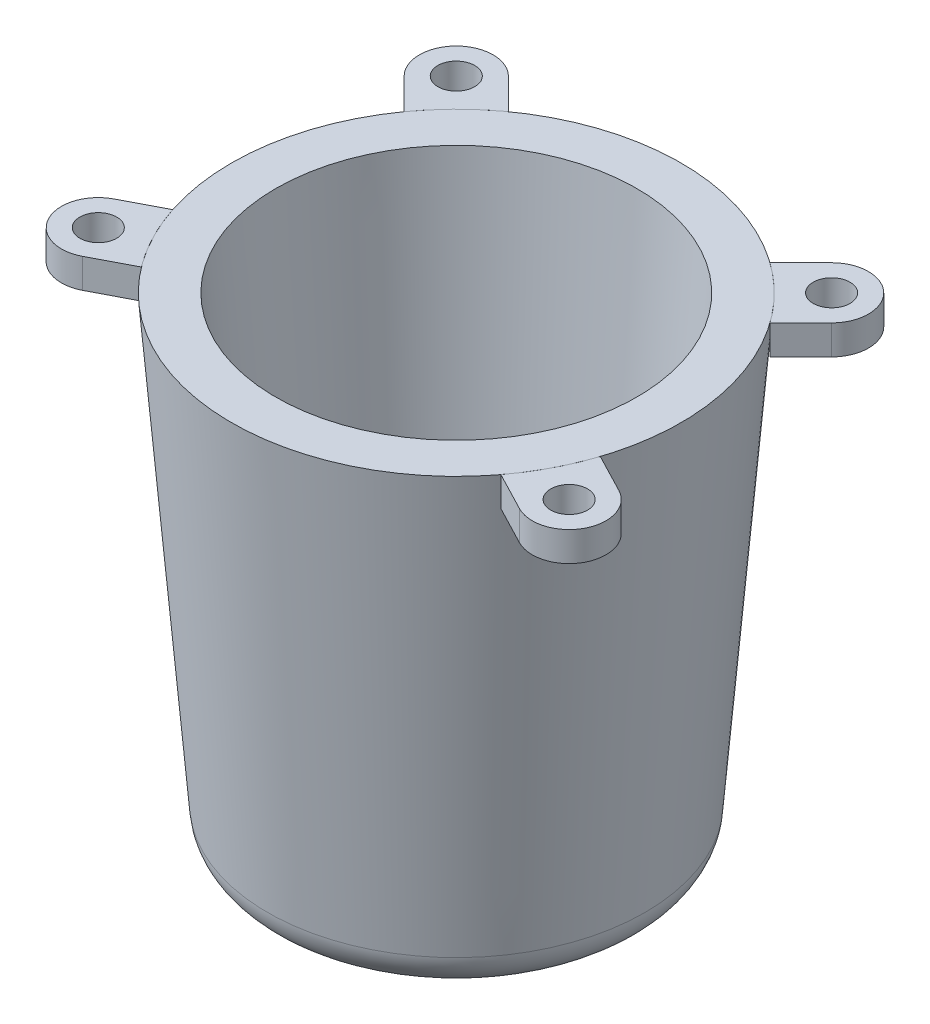
ISO-10303-21;
HEADER;
FILE_DESCRIPTION(('STEP AP214'),'2;1');
FILE_NAME('part.step','',(''),(''),'','','');
FILE_SCHEMA(('AUTOMOTIVE_DESIGN { 1 0 10303 214 1 1 1 1 }'));
ENDSEC;
DATA;
#1=APPLICATION_CONTEXT('core data for automotive mechanical design processes');
#2=APPLICATION_PROTOCOL_DEFINITION('international standard','automotive_design',2000,#1);
#3=PRODUCT_CONTEXT('',#1,'mechanical');
#4=PRODUCT('Part','Part','',(#3));
#5=PRODUCT_RELATED_PRODUCT_CATEGORY('part','',(#4));
#6=PRODUCT_DEFINITION_FORMATION('','',#4);
#7=PRODUCT_DEFINITION_CONTEXT('part definition',#1,'design');
#8=PRODUCT_DEFINITION('design','',#6,#7);
#9=PRODUCT_DEFINITION_SHAPE('','',#8);
#10=(LENGTH_UNIT() NAMED_UNIT(*) SI_UNIT(.MILLI.,.METRE.));
#11=(NAMED_UNIT(*) PLANE_ANGLE_UNIT() SI_UNIT($,.RADIAN.));
#12=(NAMED_UNIT(*) SI_UNIT($,.STERADIAN.) SOLID_ANGLE_UNIT());
#13=UNCERTAINTY_MEASURE_WITH_UNIT(LENGTH_MEASURE(1.E-05),#10,'distance_accuracy_value','');
#14=(GEOMETRIC_REPRESENTATION_CONTEXT(3) GLOBAL_UNCERTAINTY_ASSIGNED_CONTEXT((#13)) GLOBAL_UNIT_ASSIGNED_CONTEXT((#10,
#11,#12)) REPRESENTATION_CONTEXT('',''));
#15=CARTESIAN_POINT('',(0.,0.,0.));
#16=DIRECTION('',(0.,0.,1.));
#17=DIRECTION('',(1.,0.,0.));
#18=AXIS2_PLACEMENT_3D('',#15,#16,#17);
#19=CARTESIAN_POINT('',(15.966194997208,-2.,8.31147503823066));
#20=DIRECTION('',(0.,1.,0.));
#21=DIRECTION('',(-1.,0.,0.));
#22=AXIS2_PLACEMENT_3D('',#19,#20,#21);
#23=CYLINDRICAL_SURFACE('',#22,2.5);
#24=CARTESIAN_POINT('',(15.966194997208,0.,8.31147503823066));
#25=DIRECTION('',(0.,1.,0.));
#26=DIRECTION('',(-1.,0.,0.));
#27=AXIS2_PLACEMENT_3D('',#24,#25,#26);
#28=CIRCLE('',#27,2.5);
#29=CARTESIAN_POINT('',(17.1205665302956,0.,6.0939479552851));
#30=VERTEX_POINT('',#29);
#31=CARTESIAN_POINT('',(14.8118234641204,0.,10.5290021211762));
#32=VERTEX_POINT('',#31);
#33=EDGE_CURVE('E113',#30,#32,#28,.F.);
#34=ORIENTED_EDGE('',*,*,#33,.T.);
#35=DIRECTION('',(0.,1.,0.));
#36=VECTOR('',#35,1.);
#37=CARTESIAN_POINT('',(14.8118234641204,-2.,10.5290021211762));
#38=LINE('',#37,#36);
#39=CARTESIAN_POINT('',(14.8118234641204,-2.,10.5290021211762));
#40=VERTEX_POINT('',#39);
#41=EDGE_CURVE('E12',#40,#32,#38,.T.);
#42=ORIENTED_EDGE('',*,*,#41,.F.);
#43=CARTESIAN_POINT('',(15.966194997208,-2.,8.31147503823066));
#44=DIRECTION('',(0.,1.,0.));
#45=DIRECTION('',(-1.,0.,0.));
#46=AXIS2_PLACEMENT_3D('',#43,#44,#45);
#47=CIRCLE('',#46,2.5);
#48=CARTESIAN_POINT('',(17.1205665302956,-2.,6.0939479552851));
#49=VERTEX_POINT('',#48);
#50=EDGE_CURVE('E103',#49,#40,#47,.F.);
#51=ORIENTED_EDGE('',*,*,#50,.F.);
#52=DIRECTION('',(0.,1.,0.));
#53=VECTOR('',#52,1.);
#54=CARTESIAN_POINT('',(17.1205665302956,-2.,6.0939479552851));
#55=LINE('',#54,#53);
#56=EDGE_CURVE('E47',#49,#30,#55,.T.);
#57=ORIENTED_EDGE('',*,*,#56,.T.);
#58=EDGE_LOOP('',(#34,#42,#51,#57));
#59=FACE_BOUND('',#58,.T.);
#60=ADVANCED_FACE('F43',(#59),#23,.T.);
#61=CARTESIAN_POINT('',(-1.15437153308759,-2.,2.21752708294556));
#62=DIRECTION('',(0.461748613235036,0.,-0.887010833178221));
#63=DIRECTION('',(-0.887010833178221,0.,-0.461748613235036));
#64=AXIS2_PLACEMENT_3D('',#61,#62,#63);
#65=PLANE('',#64);
#66=DIRECTION('',(-0.887010833178221,0.,-0.461748613235036));
#67=VECTOR('',#66,1.);
#68=CARTESIAN_POINT('',(-1.1543715330876,0.,2.21752708294556));
#69=LINE('',#68,#67);
#70=CARTESIAN_POINT('',(12.1895412598621,0.,9.16392840839116));
#71=VERTEX_POINT('',#70);
#72=EDGE_CURVE('E75',#32,#71,#69,.T.);
#73=ORIENTED_EDGE('',*,*,#72,.T.);
#74=DIRECTION('',(0.,1.,0.));
#75=VECTOR('',#74,1.);
#76=CARTESIAN_POINT('',(12.1895412598621,-2.,9.16392840839116));
#77=LINE('',#76,#75);
#78=CARTESIAN_POINT('',(12.1895412598621,-2.,9.16392840839116));
#79=VERTEX_POINT('',#78);
#80=EDGE_CURVE('E53',#79,#71,#77,.T.);
#81=ORIENTED_EDGE('',*,*,#80,.F.);
#82=DIRECTION('',(-0.887010833178221,0.,-0.461748613235036));
#83=VECTOR('',#82,1.);
#84=CARTESIAN_POINT('',(-1.15437153308759,-2.,2.21752708294556));
#85=LINE('',#84,#83);
#86=EDGE_CURVE('E61',#40,#79,#85,.T.);
#87=ORIENTED_EDGE('',*,*,#86,.F.);
#88=ORIENTED_EDGE('',*,*,#41,.T.);
#89=EDGE_LOOP('',(#73,#81,#87,#88));
#90=FACE_BOUND('',#89,.T.);
#91=ADVANCED_FACE('F123',(#90),#65,.F.);
#92=CARTESIAN_POINT('',(0.,-2.,0.));
#93=DIRECTION('',(0.,1.,0.));
#94=DIRECTION('',(-1.,0.,0.));
#95=AXIS2_PLACEMENT_3D('',#92,#93,#94);
#96=CYLINDRICAL_SURFACE('',#95,15.25);
#97=CARTESIAN_POINT('',(0.,0.,0.));
#98=DIRECTION('',(0.,1.,0.));
#99=DIRECTION('',(-1.,0.,0.));
#100=AXIS2_PLACEMENT_3D('',#97,#98,#99);
#101=CIRCLE('',#100,15.25);
#102=CARTESIAN_POINT('',(14.4982843260373,0.,4.72887424250005));
#103=VERTEX_POINT('',#102);
#104=EDGE_CURVE('E100',#71,#103,#101,.T.);
#105=ORIENTED_EDGE('',*,*,#104,.T.);
#106=DIRECTION('',(0.,1.,0.));
#107=VECTOR('',#106,1.);
#108=CARTESIAN_POINT('',(14.4982843260373,-2.,4.72887424250005));
#109=LINE('',#108,#107);
#110=CARTESIAN_POINT('',(14.4982843260373,-2.,4.72887424250005));
#111=VERTEX_POINT('',#110);
#112=EDGE_CURVE('E98',#111,#103,#109,.T.);
#113=ORIENTED_EDGE('',*,*,#112,.F.);
#114=CARTESIAN_POINT('',(0.,-2.,0.));
#115=DIRECTION('',(0.,1.,0.));
#116=DIRECTION('',(-1.,0.,0.));
#117=AXIS2_PLACEMENT_3D('',#114,#115,#116);
#118=CIRCLE('',#117,15.25);
#119=EDGE_CURVE('E91',#79,#111,#118,.T.);
#120=ORIENTED_EDGE('',*,*,#119,.F.);
#121=ORIENTED_EDGE('',*,*,#80,.T.);
#122=EDGE_LOOP('',(#105,#113,#120,#121));
#123=FACE_BOUND('',#122,.T.);
#124=ADVANCED_FACE('F99',(#123),#96,.F.);
#125=CARTESIAN_POINT('',(15.966194997208,-2.,8.31147503823066));
#126=DIRECTION('',(0.,1.,0.));
#127=DIRECTION('',(-1.,0.,0.));
#128=AXIS2_PLACEMENT_3D('',#125,#126,#127);
#129=CYLINDRICAL_SURFACE('',#128,1.25);
#130=CARTESIAN_POINT('',(15.966194997208,-2.,8.31147503823066));
#131=DIRECTION('',(0.,1.,0.));
#132=DIRECTION('',(-1.,0.,0.));
#133=AXIS2_PLACEMENT_3D('',#130,#131,#132);
#134=CIRCLE('',#133,1.25);
#135=CARTESIAN_POINT('',(14.716194997208,-2.,8.31147503823066));
#136=VERTEX_POINT('',#135);
#137=EDGE_CURVE('E105',#136,#136,#134,.T.);
#138=ORIENTED_EDGE('',*,*,#137,.F.);
#139=EDGE_LOOP('',(#138));
#140=FACE_BOUND('',#139,.T.);
#141=CARTESIAN_POINT('',(15.966194997208,0.,8.31147503823066));
#142=DIRECTION('',(0.,1.,0.));
#143=DIRECTION('',(-1.,0.,0.));
#144=AXIS2_PLACEMENT_3D('',#141,#142,#143);
#145=CIRCLE('',#144,1.25);
#146=CARTESIAN_POINT('',(14.716194997208,0.,8.31147503823066));
#147=VERTEX_POINT('',#146);
#148=EDGE_CURVE('E110',#147,#147,#145,.T.);
#149=ORIENTED_EDGE('',*,*,#148,.T.);
#150=EDGE_LOOP('',(#149));
#151=FACE_BOUND('',#150,.T.);
#152=ADVANCED_FACE('F45',(#140,#151),#129,.F.);
#153=CARTESIAN_POINT('',(1.15437153308758,-2.,-2.21752708294554));
#154=DIRECTION('',(0.461748613235036,0.,-0.887010833178221));
#155=DIRECTION('',(-0.887010833178221,0.,-0.461748613235035));
#156=AXIS2_PLACEMENT_3D('',#153,#154,#155);
#157=PLANE('',#156);
#158=DIRECTION('',(-0.887010833178221,0.,-0.461748613235036));
#159=VECTOR('',#158,1.);
#160=CARTESIAN_POINT('',(1.15437153308758,0.,-2.21752708294554));
#161=LINE('',#160,#159);
#162=EDGE_CURVE('E116',#30,#103,#161,.T.);
#163=ORIENTED_EDGE('',*,*,#162,.F.);
#164=ORIENTED_EDGE('',*,*,#56,.F.);
#165=DIRECTION('',(-0.887010833178221,0.,-0.461748613235036));
#166=VECTOR('',#165,1.);
#167=CARTESIAN_POINT('',(1.15437153308758,-2.,-2.21752708294554));
#168=LINE('',#167,#166);
#169=EDGE_CURVE('E94',#49,#111,#168,.T.);
#170=ORIENTED_EDGE('',*,*,#169,.T.);
#171=ORIENTED_EDGE('',*,*,#112,.T.);
#172=EDGE_LOOP('',(#163,#164,#170,#171));
#173=FACE_BOUND('',#172,.T.);
#174=ADVANCED_FACE('F102',(#173),#157,.T.);
#175=CARTESIAN_POINT('',(0.,-2.,0.));
#176=DIRECTION('',(0.,1.,0.));
#177=DIRECTION('',(-1.,0.,0.));
#178=AXIS2_PLACEMENT_3D('',#175,#176,#177);
#179=PLANE('',#178);
#180=ORIENTED_EDGE('',*,*,#137,.T.);
#181=EDGE_LOOP('',(#180));
#182=FACE_BOUND('',#181,.T.);
#183=ORIENTED_EDGE('',*,*,#50,.T.);
#184=ORIENTED_EDGE('',*,*,#86,.T.);
#185=ORIENTED_EDGE('',*,*,#119,.T.);
#186=ORIENTED_EDGE('',*,*,#169,.F.);
#187=EDGE_LOOP('',(#183,#184,#185,#186));
#188=FACE_BOUND('',#187,.T.);
#189=ADVANCED_FACE('F93',(#182,#188),#179,.F.);
#190=CARTESIAN_POINT('',(0.,0.,0.));
#191=DIRECTION('',(0.,1.,0.));
#192=DIRECTION('',(-1.,0.,0.));
#193=AXIS2_PLACEMENT_3D('',#190,#191,#192);
#194=PLANE('',#193);
#195=ORIENTED_EDGE('',*,*,#148,.F.);
#196=EDGE_LOOP('',(#195));
#197=FACE_BOUND('',#196,.T.);
#198=ORIENTED_EDGE('',*,*,#33,.F.);
#199=ORIENTED_EDGE('',*,*,#162,.T.);
#200=ORIENTED_EDGE('',*,*,#104,.F.);
#201=ORIENTED_EDGE('',*,*,#72,.F.);
#202=EDGE_LOOP('',(#198,#199,#200,#201));
#203=FACE_BOUND('',#202,.T.);
#204=ADVANCED_FACE('F120',(#197,#203),#194,.T.);
#205=CLOSED_SHELL('',(#60,#91,#124,#152,#174,#189,#204));
#206=MANIFOLD_SOLID_BREP('B2',#205);
#207=CARTESIAN_POINT('',(-1.15437153308758,-2.,-2.21752708294554));
#208=DIRECTION('',(0.461748613235036,0.,0.887010833178221));
#209=DIRECTION('',(0.887010833178221,0.,-0.461748613235035));
#210=AXIS2_PLACEMENT_3D('',#207,#208,#209);
#211=PLANE('',#210);
#212=DIRECTION('',(0.887010833178221,0.,-0.461748613235036));
#213=VECTOR('',#212,1.);
#214=CARTESIAN_POINT('',(-1.15437153308758,0.,-2.21752708294554));
#215=LINE('',#214,#213);
#216=CARTESIAN_POINT('',(-17.1205665302956,0.,6.0939479552851));
#217=VERTEX_POINT('',#216);
#218=CARTESIAN_POINT('',(-14.4982843260373,0.,4.72887424250005));
#219=VERTEX_POINT('',#218);
#220=EDGE_CURVE('E266',#217,#219,#215,.T.);
#221=ORIENTED_EDGE('',*,*,#220,.T.);
#222=DIRECTION('',(0.,1.,0.));
#223=VECTOR('',#222,1.);
#224=CARTESIAN_POINT('',(-14.4982843260373,-2.,4.72887424250005));
#225=LINE('',#224,#223);
#226=CARTESIAN_POINT('',(-14.4982843260373,-2.,4.72887424250005));
#227=VERTEX_POINT('',#226);
#228=EDGE_CURVE('E41',#227,#219,#225,.T.);
#229=ORIENTED_EDGE('',*,*,#228,.F.);
#230=DIRECTION('',(0.887010833178221,0.,-0.461748613235036));
#231=VECTOR('',#230,1.);
#232=CARTESIAN_POINT('',(-1.15437153308758,-2.,-2.21752708294554));
#233=LINE('',#232,#231);
#234=CARTESIAN_POINT('',(-17.1205665302956,-2.,6.0939479552851));
#235=VERTEX_POINT('',#234);
#236=EDGE_CURVE('E257',#235,#227,#233,.T.);
#237=ORIENTED_EDGE('',*,*,#236,.F.);
#238=DIRECTION('',(0.,1.,0.));
#239=VECTOR('',#238,1.);
#240=CARTESIAN_POINT('',(-17.1205665302956,-2.,6.0939479552851));
#241=LINE('',#240,#239);
#242=EDGE_CURVE('E200',#235,#217,#241,.T.);
#243=ORIENTED_EDGE('',*,*,#242,.T.);
#244=EDGE_LOOP('',(#221,#229,#237,#243));
#245=FACE_BOUND('',#244,.T.);
#246=ADVANCED_FACE('F197',(#245),#211,.F.);
#247=CARTESIAN_POINT('',(0.,-2.,0.));
#248=DIRECTION('',(0.,1.,0.));
#249=DIRECTION('',(-1.,0.,0.));
#250=AXIS2_PLACEMENT_3D('',#247,#248,#249);
#251=CYLINDRICAL_SURFACE('',#250,15.25);
#252=CARTESIAN_POINT('',(0.,0.,0.));
#253=DIRECTION('',(0.,1.,0.));
#254=DIRECTION('',(-1.,0.,0.));
#255=AXIS2_PLACEMENT_3D('',#252,#253,#254);
#256=CIRCLE('',#255,15.25);
#257=CARTESIAN_POINT('',(-12.1895412598621,0.,9.16392840839116));
#258=VERTEX_POINT('',#257);
#259=EDGE_CURVE('E236',#219,#258,#256,.T.);
#260=ORIENTED_EDGE('',*,*,#259,.T.);
#261=DIRECTION('',(0.,1.,0.));
#262=VECTOR('',#261,1.);
#263=CARTESIAN_POINT('',(-12.1895412598621,-2.,9.16392840839116));
#264=LINE('',#263,#262);
#265=CARTESIAN_POINT('',(-12.1895412598621,-2.,9.16392840839116));
#266=VERTEX_POINT('',#265);
#267=EDGE_CURVE('E206',#266,#258,#264,.T.);
#268=ORIENTED_EDGE('',*,*,#267,.F.);
#269=CARTESIAN_POINT('',(0.,-2.,0.));
#270=DIRECTION('',(0.,1.,0.));
#271=DIRECTION('',(-1.,0.,0.));
#272=AXIS2_PLACEMENT_3D('',#269,#270,#271);
#273=CIRCLE('',#272,15.25);
#274=EDGE_CURVE('E214',#227,#266,#273,.T.);
#275=ORIENTED_EDGE('',*,*,#274,.F.);
#276=ORIENTED_EDGE('',*,*,#228,.T.);
#277=EDGE_LOOP('',(#260,#268,#275,#276));
#278=FACE_BOUND('',#277,.T.);
#279=ADVANCED_FACE('F291',(#278),#251,.F.);
#280=CARTESIAN_POINT('',(1.15437153308759,-2.,2.21752708294556));
#281=DIRECTION('',(0.461748613235036,0.,0.887010833178221));
#282=DIRECTION('',(0.887010833178221,0.,-0.461748613235036));
#283=AXIS2_PLACEMENT_3D('',#280,#281,#282);
#284=PLANE('',#283);
#285=DIRECTION('',(0.887010833178221,0.,-0.461748613235036));
#286=VECTOR('',#285,1.);
#287=CARTESIAN_POINT('',(1.15437153308759,0.,2.21752708294556));
#288=LINE('',#287,#286);
#289=CARTESIAN_POINT('',(-14.8118234641204,0.,10.5290021211762));
#290=VERTEX_POINT('',#289);
#291=EDGE_CURVE('E248',#290,#258,#288,.T.);
#292=ORIENTED_EDGE('',*,*,#291,.F.);
#293=DIRECTION('',(0.,1.,0.));
#294=VECTOR('',#293,1.);
#295=CARTESIAN_POINT('',(-14.8118234641204,-2.,10.5290021211762));
#296=LINE('',#295,#294);
#297=CARTESIAN_POINT('',(-14.8118234641204,-2.,10.5290021211762));
#298=VERTEX_POINT('',#297);
#299=EDGE_CURVE('E244',#298,#290,#296,.T.);
#300=ORIENTED_EDGE('',*,*,#299,.F.);
#301=DIRECTION('',(0.887010833178221,0.,-0.461748613235036));
#302=VECTOR('',#301,1.);
#303=CARTESIAN_POINT('',(1.15437153308759,-2.,2.21752708294556));
#304=LINE('',#303,#302);
#305=EDGE_CURVE('E247',#298,#266,#304,.T.);
#306=ORIENTED_EDGE('',*,*,#305,.T.);
#307=ORIENTED_EDGE('',*,*,#267,.T.);
#308=EDGE_LOOP('',(#292,#300,#306,#307));
#309=FACE_BOUND('',#308,.T.);
#310=ADVANCED_FACE('F246',(#309),#284,.T.);
#311=CARTESIAN_POINT('',(-15.966194997208,-2.,8.31147503823066));
#312=DIRECTION('',(0.,1.,0.));
#313=DIRECTION('',(-1.,0.,0.));
#314=AXIS2_PLACEMENT_3D('',#311,#312,#313);
#315=CYLINDRICAL_SURFACE('',#314,2.5);
#316=CARTESIAN_POINT('',(-15.966194997208,0.,8.31147503823066));
#317=DIRECTION('',(0.,1.,0.));
#318=DIRECTION('',(-1.,0.,0.));
#319=AXIS2_PLACEMENT_3D('',#316,#317,#318);
#320=CIRCLE('',#319,2.5);
#321=EDGE_CURVE('E269',#217,#290,#320,.T.);
#322=ORIENTED_EDGE('',*,*,#321,.F.);
#323=ORIENTED_EDGE('',*,*,#242,.F.);
#324=CARTESIAN_POINT('',(-15.966194997208,-2.,8.31147503823066));
#325=DIRECTION('',(0.,1.,0.));
#326=DIRECTION('',(-1.,0.,0.));
#327=AXIS2_PLACEMENT_3D('',#324,#325,#326);
#328=CIRCLE('',#327,2.5);
#329=EDGE_CURVE('E254',#235,#298,#328,.T.);
#330=ORIENTED_EDGE('',*,*,#329,.T.);
#331=ORIENTED_EDGE('',*,*,#299,.T.);
#332=EDGE_LOOP('',(#322,#323,#330,#331));
#333=FACE_BOUND('',#332,.T.);
#334=ADVANCED_FACE('F256',(#333),#315,.T.);
#335=CARTESIAN_POINT('',(-15.966194997208,-2.,8.31147503823066));
#336=DIRECTION('',(0.,1.,0.));
#337=DIRECTION('',(-1.,0.,0.));
#338=AXIS2_PLACEMENT_3D('',#335,#336,#337);
#339=CYLINDRICAL_SURFACE('',#338,1.25);
#340=CARTESIAN_POINT('',(-15.966194997208,-2.,8.31147503823066));
#341=DIRECTION('',(0.,1.,0.));
#342=DIRECTION('',(-1.,0.,0.));
#343=AXIS2_PLACEMENT_3D('',#340,#341,#342);
#344=CIRCLE('',#343,1.25);
#345=CARTESIAN_POINT('',(-17.216194997208,-2.,8.31147503823066));
#346=VERTEX_POINT('',#345);
#347=EDGE_CURVE('E263',#346,#346,#344,.F.);
#348=ORIENTED_EDGE('',*,*,#347,.T.);
#349=EDGE_LOOP('',(#348));
#350=FACE_BOUND('',#349,.T.);
#351=CARTESIAN_POINT('',(-15.966194997208,0.,8.31147503823066));
#352=DIRECTION('',(0.,1.,0.));
#353=DIRECTION('',(-1.,0.,0.));
#354=AXIS2_PLACEMENT_3D('',#351,#352,#353);
#355=CIRCLE('',#354,1.25);
#356=CARTESIAN_POINT('',(-17.216194997208,0.,8.31147503823066));
#357=VERTEX_POINT('',#356);
#358=EDGE_CURVE('E259',#357,#357,#355,.F.);
#359=ORIENTED_EDGE('',*,*,#358,.F.);
#360=EDGE_LOOP('',(#359));
#361=FACE_BOUND('',#360,.T.);
#362=ADVANCED_FACE('F279',(#350,#361),#339,.F.);
#363=CARTESIAN_POINT('',(0.,-2.,0.));
#364=DIRECTION('',(0.,1.,0.));
#365=DIRECTION('',(-1.,0.,0.));
#366=AXIS2_PLACEMENT_3D('',#363,#364,#365);
#367=PLANE('',#366);
#368=ORIENTED_EDGE('',*,*,#236,.T.);
#369=ORIENTED_EDGE('',*,*,#274,.T.);
#370=ORIENTED_EDGE('',*,*,#305,.F.);
#371=ORIENTED_EDGE('',*,*,#329,.F.);
#372=EDGE_LOOP('',(#368,#369,#370,#371));
#373=FACE_BOUND('',#372,.T.);
#374=ORIENTED_EDGE('',*,*,#347,.F.);
#375=EDGE_LOOP('',(#374));
#376=FACE_BOUND('',#375,.T.);
#377=ADVANCED_FACE('F252',(#373,#376),#367,.F.);
#378=CARTESIAN_POINT('',(0.,0.,0.));
#379=DIRECTION('',(0.,1.,0.));
#380=DIRECTION('',(-1.,0.,0.));
#381=AXIS2_PLACEMENT_3D('',#378,#379,#380);
#382=PLANE('',#381);
#383=ORIENTED_EDGE('',*,*,#220,.F.);
#384=ORIENTED_EDGE('',*,*,#321,.T.);
#385=ORIENTED_EDGE('',*,*,#291,.T.);
#386=ORIENTED_EDGE('',*,*,#259,.F.);
#387=EDGE_LOOP('',(#383,#384,#385,#386));
#388=FACE_BOUND('',#387,.T.);
#389=ORIENTED_EDGE('',*,*,#358,.T.);
#390=EDGE_LOOP('',(#389));
#391=FACE_BOUND('',#390,.T.);
#392=ADVANCED_FACE('F277',(#388,#391),#382,.T.);
#393=CLOSED_SHELL('',(#246,#279,#310,#334,#362,#377,#392));
#394=MANIFOLD_SOLID_BREP('B6',#393);
#395=CARTESIAN_POINT('',(1.76776695296619,-2.,-1.76776695296613));
#396=DIRECTION('',(-0.707106781186561,0.,0.707106781186534));
#397=DIRECTION('',(0.707106781186534,0.,0.707106781186561));
#398=AXIS2_PLACEMENT_3D('',#395,#396,#397);
#399=PLANE('',#398);
#400=DIRECTION('',(0.707106781186534,0.,0.707106781186561));
#401=VECTOR('',#400,1.);
#402=CARTESIAN_POINT('',(1.76776695296619,0.,-1.76776695296613));
#403=LINE('',#402,#401);
#404=CARTESIAN_POINT('',(-10.9601551083914,0.,-14.4956890143242));
#405=VERTEX_POINT('',#404);
#406=CARTESIAN_POINT('',(-8.86972570273029,0.,-12.405259608663));
#407=VERTEX_POINT('',#406);
#408=EDGE_CURVE('E421',#405,#407,#403,.T.);
#409=ORIENTED_EDGE('',*,*,#408,.T.);
#410=DIRECTION('',(0.,1.,0.));
#411=VECTOR('',#410,1.);
#412=CARTESIAN_POINT('',(-8.86972570273029,-2.,-12.405259608663));
#413=LINE('',#412,#411);
#414=CARTESIAN_POINT('',(-8.86972570273029,-2.,-12.405259608663));
#415=VERTEX_POINT('',#414);
#416=EDGE_CURVE('E195',#415,#407,#413,.T.);
#417=ORIENTED_EDGE('',*,*,#416,.F.);
#418=DIRECTION('',(0.707106781186534,0.,0.707106781186561));
#419=VECTOR('',#418,1.);
#420=CARTESIAN_POINT('',(1.76776695296619,-2.,-1.76776695296613));
#421=LINE('',#420,#419);
#422=CARTESIAN_POINT('',(-10.9601551083914,-2.,-14.4956890143242));
#423=VERTEX_POINT('',#422);
#424=EDGE_CURVE('E411',#423,#415,#421,.T.);
#425=ORIENTED_EDGE('',*,*,#424,.F.);
#426=DIRECTION('',(0.,1.,0.));
#427=VECTOR('',#426,1.);
#428=CARTESIAN_POINT('',(-10.9601551083914,-2.,-14.4956890143242));
#429=LINE('',#428,#427);
#430=EDGE_CURVE('E355',#423,#405,#429,.T.);
#431=ORIENTED_EDGE('',*,*,#430,.T.);
#432=EDGE_LOOP('',(#409,#417,#425,#431));
#433=FACE_BOUND('',#432,.T.);
#434=ADVANCED_FACE('F351',(#433),#399,.F.);
#435=CARTESIAN_POINT('',(0.,-2.,0.));
#436=DIRECTION('',(0.,1.,0.));
#437=DIRECTION('',(-1.,0.,0.));
#438=AXIS2_PLACEMENT_3D('',#435,#436,#437);
#439=CYLINDRICAL_SURFACE('',#438,15.25);
#440=CARTESIAN_POINT('',(0.,0.,0.));
#441=DIRECTION('',(0.,1.,0.));
#442=DIRECTION('',(-1.,0.,0.));
#443=AXIS2_PLACEMENT_3D('',#440,#441,#442);
#444=CIRCLE('',#443,15.25);
#445=CARTESIAN_POINT('',(-12.405259608663,0.,-8.86972570273029));
#446=VERTEX_POINT('',#445);
#447=EDGE_CURVE('E391',#407,#446,#444,.T.);
#448=ORIENTED_EDGE('',*,*,#447,.T.);
#449=DIRECTION('',(0.,1.,0.));
#450=VECTOR('',#449,1.);
#451=CARTESIAN_POINT('',(-12.405259608663,-2.,-8.86972570273029));
#452=LINE('',#451,#450);
#453=CARTESIAN_POINT('',(-12.405259608663,-2.,-8.86972570273029));
#454=VERTEX_POINT('',#453);
#455=EDGE_CURVE('E361',#454,#446,#452,.T.);
#456=ORIENTED_EDGE('',*,*,#455,.F.);
#457=CARTESIAN_POINT('',(0.,-2.,0.));
#458=DIRECTION('',(0.,1.,0.));
#459=DIRECTION('',(-1.,0.,0.));
#460=AXIS2_PLACEMENT_3D('',#457,#458,#459);
#461=CIRCLE('',#460,15.25);
#462=EDGE_CURVE('E369',#415,#454,#461,.T.);
#463=ORIENTED_EDGE('',*,*,#462,.F.);
#464=ORIENTED_EDGE('',*,*,#416,.T.);
#465=EDGE_LOOP('',(#448,#456,#463,#464));
#466=FACE_BOUND('',#465,.T.);
#467=ADVANCED_FACE('F444',(#466),#439,.F.);
#468=CARTESIAN_POINT('',(-1.7677669529664,-2.,1.76776695296639));
#469=DIRECTION('',(-0.70710678118655,0.,0.707106781186545));
#470=DIRECTION('',(0.707106781186545,0.,0.70710678118655));
#471=AXIS2_PLACEMENT_3D('',#468,#469,#470);
#472=PLANE('',#471);
#473=DIRECTION('',(0.707106781186545,0.,0.70710678118655));
#474=VECTOR('',#473,1.);
#475=CARTESIAN_POINT('',(-1.7677669529664,0.,1.76776695296639));
#476=LINE('',#475,#474);
#477=CARTESIAN_POINT('',(-14.4956890143242,0.,-10.9601551083915));
#478=VERTEX_POINT('',#477);
#479=EDGE_CURVE('E403',#478,#446,#476,.T.);
#480=ORIENTED_EDGE('',*,*,#479,.F.);
#481=DIRECTION('',(0.,1.,0.));
#482=VECTOR('',#481,1.);
#483=CARTESIAN_POINT('',(-14.4956890143242,-2.,-10.9601551083915));
#484=LINE('',#483,#482);
#485=CARTESIAN_POINT('',(-14.4956890143242,-2.,-10.9601551083915));
#486=VERTEX_POINT('',#485);
#487=EDGE_CURVE('E399',#486,#478,#484,.T.);
#488=ORIENTED_EDGE('',*,*,#487,.F.);
#489=DIRECTION('',(0.707106781186545,0.,0.70710678118655));
#490=VECTOR('',#489,1.);
#491=CARTESIAN_POINT('',(-1.7677669529664,-2.,1.76776695296639));
#492=LINE('',#491,#490);
#493=EDGE_CURVE('E402',#486,#454,#492,.T.);
#494=ORIENTED_EDGE('',*,*,#493,.T.);
#495=ORIENTED_EDGE('',*,*,#455,.T.);
#496=EDGE_LOOP('',(#480,#488,#494,#495));
#497=FACE_BOUND('',#496,.T.);
#498=ADVANCED_FACE('F401',(#497),#472,.T.);
#499=CARTESIAN_POINT('',(-12.7279220613578,-2.,-12.7279220613579));
#500=DIRECTION('',(0.,1.,0.));
#501=DIRECTION('',(-1.,0.,0.));
#502=AXIS2_PLACEMENT_3D('',#499,#500,#501);
#503=CYLINDRICAL_SURFACE('',#502,1.25);
#504=CARTESIAN_POINT('',(-12.7279220613578,-2.,-12.7279220613579));
#505=DIRECTION('',(0.,1.,0.));
#506=DIRECTION('',(-1.,0.,0.));
#507=AXIS2_PLACEMENT_3D('',#504,#505,#506);
#508=CIRCLE('',#507,1.25);
#509=CARTESIAN_POINT('',(-13.9779220613578,-2.,-12.7279220613579));
#510=VERTEX_POINT('',#509);
#511=EDGE_CURVE('E413',#510,#510,#508,.F.);
#512=ORIENTED_EDGE('',*,*,#511,.T.);
#513=EDGE_LOOP('',(#512));
#514=FACE_BOUND('',#513,.T.);
#515=CARTESIAN_POINT('',(-12.7279220613578,0.,-12.7279220613579));
#516=DIRECTION('',(0.,1.,0.));
#517=DIRECTION('',(-1.,0.,0.));
#518=AXIS2_PLACEMENT_3D('',#515,#516,#517);
#519=CIRCLE('',#518,1.25);
#520=CARTESIAN_POINT('',(-13.9779220613578,0.,-12.7279220613579));
#521=VERTEX_POINT('',#520);
#522=EDGE_CURVE('E418',#521,#521,#519,.F.);
#523=ORIENTED_EDGE('',*,*,#522,.F.);
#524=EDGE_LOOP('',(#523));
#525=FACE_BOUND('',#524,.T.);
#526=ADVANCED_FACE('F353',(#514,#525),#503,.F.);
#527=CARTESIAN_POINT('',(-12.7279220613578,-2.,-12.7279220613579));
#528=DIRECTION('',(0.,1.,0.));
#529=DIRECTION('',(-1.,0.,0.));
#530=AXIS2_PLACEMENT_3D('',#527,#528,#529);
#531=CYLINDRICAL_SURFACE('',#530,2.5);
#532=CARTESIAN_POINT('',(-12.7279220613578,0.,-12.7279220613579));
#533=DIRECTION('',(0.,1.,0.));
#534=DIRECTION('',(-1.,0.,0.));
#535=AXIS2_PLACEMENT_3D('',#532,#533,#534);
#536=CIRCLE('',#535,2.5);
#537=EDGE_CURVE('E424',#405,#478,#536,.T.);
#538=ORIENTED_EDGE('',*,*,#537,.F.);
#539=ORIENTED_EDGE('',*,*,#430,.F.);
#540=CARTESIAN_POINT('',(-12.7279220613578,-2.,-12.7279220613579));
#541=DIRECTION('',(0.,1.,0.));
#542=DIRECTION('',(-1.,0.,0.));
#543=AXIS2_PLACEMENT_3D('',#540,#541,#542);
#544=CIRCLE('',#543,2.5);
#545=EDGE_CURVE('E408',#423,#486,#544,.T.);
#546=ORIENTED_EDGE('',*,*,#545,.T.);
#547=ORIENTED_EDGE('',*,*,#487,.T.);
#548=EDGE_LOOP('',(#538,#539,#546,#547));
#549=FACE_BOUND('',#548,.T.);
#550=ADVANCED_FACE('F410',(#549),#531,.T.);
#551=CARTESIAN_POINT('',(0.,-2.,0.));
#552=DIRECTION('',(0.,1.,0.));
#553=DIRECTION('',(-1.,0.,0.));
#554=AXIS2_PLACEMENT_3D('',#551,#552,#553);
#555=PLANE('',#554);
#556=ORIENTED_EDGE('',*,*,#511,.F.);
#557=EDGE_LOOP('',(#556));
#558=FACE_BOUND('',#557,.T.);
#559=ORIENTED_EDGE('',*,*,#424,.T.);
#560=ORIENTED_EDGE('',*,*,#462,.T.);
#561=ORIENTED_EDGE('',*,*,#493,.F.);
#562=ORIENTED_EDGE('',*,*,#545,.F.);
#563=EDGE_LOOP('',(#559,#560,#561,#562));
#564=FACE_BOUND('',#563,.T.);
#565=ADVANCED_FACE('F407',(#558,#564),#555,.F.);
#566=CARTESIAN_POINT('',(0.,0.,0.));
#567=DIRECTION('',(0.,1.,0.));
#568=DIRECTION('',(-1.,0.,0.));
#569=AXIS2_PLACEMENT_3D('',#566,#567,#568);
#570=PLANE('',#569);
#571=ORIENTED_EDGE('',*,*,#522,.T.);
#572=EDGE_LOOP('',(#571));
#573=FACE_BOUND('',#572,.T.);
#574=ORIENTED_EDGE('',*,*,#408,.F.);
#575=ORIENTED_EDGE('',*,*,#537,.T.);
#576=ORIENTED_EDGE('',*,*,#479,.T.);
#577=ORIENTED_EDGE('',*,*,#447,.F.);
#578=EDGE_LOOP('',(#574,#575,#576,#577));
#579=FACE_BOUND('',#578,.T.);
#580=ADVANCED_FACE('F434',(#573,#579),#570,.T.);
#581=CLOSED_SHELL('',(#434,#467,#498,#526,#550,#565,#580));
#582=MANIFOLD_SOLID_BREP('B35',#581);
#583=CARTESIAN_POINT('',(12.7279220613578,-2.,-12.7279220613579));
#584=DIRECTION('',(0.,1.,0.));
#585=DIRECTION('',(-1.,0.,0.));
#586=AXIS2_PLACEMENT_3D('',#583,#584,#585);
#587=CYLINDRICAL_SURFACE('',#586,2.5);
#588=CARTESIAN_POINT('',(12.7279220613578,0.,-12.7279220613579));
#589=DIRECTION('',(0.,1.,0.));
#590=DIRECTION('',(-1.,0.,0.));
#591=AXIS2_PLACEMENT_3D('',#588,#589,#590);
#592=CIRCLE('',#591,2.5);
#593=CARTESIAN_POINT('',(10.9601551083914,0.,-14.4956890143242));
#594=VERTEX_POINT('',#593);
#595=CARTESIAN_POINT('',(14.4956890143242,0.,-10.9601551083915));
#596=VERTEX_POINT('',#595);
#597=EDGE_CURVE('E571',#594,#596,#592,.F.);
#598=ORIENTED_EDGE('',*,*,#597,.T.);
#599=DIRECTION('',(0.,1.,0.));
#600=VECTOR('',#599,1.);
#601=CARTESIAN_POINT('',(14.4956890143242,-2.,-10.9601551083915));
#602=LINE('',#601,#600);
#603=CARTESIAN_POINT('',(14.4956890143242,-2.,-10.9601551083915));
#604=VERTEX_POINT('',#603);
#605=EDGE_CURVE('E349',#604,#596,#602,.T.);
#606=ORIENTED_EDGE('',*,*,#605,.F.);
#607=CARTESIAN_POINT('',(12.7279220613578,-2.,-12.7279220613579));
#608=DIRECTION('',(0.,1.,0.));
#609=DIRECTION('',(-1.,0.,0.));
#610=AXIS2_PLACEMENT_3D('',#607,#608,#609);
#611=CIRCLE('',#610,2.5);
#612=CARTESIAN_POINT('',(10.9601551083914,-2.,-14.4956890143242));
#613=VERTEX_POINT('',#612);
#614=EDGE_CURVE('E562',#613,#604,#611,.F.);
#615=ORIENTED_EDGE('',*,*,#614,.F.);
#616=DIRECTION('',(0.,1.,0.));
#617=VECTOR('',#616,1.);
#618=CARTESIAN_POINT('',(10.9601551083914,-2.,-14.4956890143242));
#619=LINE('',#618,#617);
#620=EDGE_CURVE('E505',#613,#594,#619,.T.);
#621=ORIENTED_EDGE('',*,*,#620,.T.);
#622=EDGE_LOOP('',(#598,#606,#615,#621));
#623=FACE_BOUND('',#622,.T.);
#624=ADVANCED_FACE('F502',(#623),#587,.T.);
#625=CARTESIAN_POINT('',(1.76776695296638,-2.,1.76776695296637));
#626=DIRECTION('',(-0.707106781186549,0.,-0.707106781186546));
#627=DIRECTION('',(-0.707106781186546,0.,0.707106781186549));
#628=AXIS2_PLACEMENT_3D('',#625,#626,#627);
#629=PLANE('',#628);
#630=DIRECTION('',(-0.707106781186546,0.,0.707106781186549));
#631=VECTOR('',#630,1.);
#632=CARTESIAN_POINT('',(1.76776695296638,0.,1.76776695296637));
#633=LINE('',#632,#631);
#634=CARTESIAN_POINT('',(12.405259608663,0.,-8.86972570273029));
#635=VERTEX_POINT('',#634);
#636=EDGE_CURVE('E533',#596,#635,#633,.T.);
#637=ORIENTED_EDGE('',*,*,#636,.T.);
#638=DIRECTION('',(0.,1.,0.));
#639=VECTOR('',#638,1.);
#640=CARTESIAN_POINT('',(12.405259608663,-2.,-8.86972570273029));
#641=LINE('',#640,#639);
#642=CARTESIAN_POINT('',(12.405259608663,-2.,-8.86972570273029));
#643=VERTEX_POINT('',#642);
#644=EDGE_CURVE('E511',#643,#635,#641,.T.);
#645=ORIENTED_EDGE('',*,*,#644,.F.);
#646=DIRECTION('',(-0.707106781186546,0.,0.707106781186549));
#647=VECTOR('',#646,1.);
#648=CARTESIAN_POINT('',(1.76776695296638,-2.,1.76776695296637));
#649=LINE('',#648,#647);
#650=EDGE_CURVE('E519',#604,#643,#649,.T.);
#651=ORIENTED_EDGE('',*,*,#650,.F.);
#652=ORIENTED_EDGE('',*,*,#605,.T.);
#653=EDGE_LOOP('',(#637,#645,#651,#652));
#654=FACE_BOUND('',#653,.T.);
#655=ADVANCED_FACE('F584',(#654),#629,.F.);
#656=CARTESIAN_POINT('',(0.,-2.,0.));
#657=DIRECTION('',(0.,1.,0.));
#658=DIRECTION('',(-1.,0.,0.));
#659=AXIS2_PLACEMENT_3D('',#656,#657,#658);
#660=CYLINDRICAL_SURFACE('',#659,15.25);
#661=CARTESIAN_POINT('',(0.,0.,0.));
#662=DIRECTION('',(0.,1.,0.));
#663=DIRECTION('',(-1.,0.,0.));
#664=AXIS2_PLACEMENT_3D('',#661,#662,#663);
#665=CIRCLE('',#664,15.25);
#666=CARTESIAN_POINT('',(8.86972570273031,0.,-12.405259608663));
#667=VERTEX_POINT('',#666);
#668=EDGE_CURVE('E559',#635,#667,#665,.T.);
#669=ORIENTED_EDGE('',*,*,#668,.T.);
#670=DIRECTION('',(0.,1.,0.));
#671=VECTOR('',#670,1.);
#672=CARTESIAN_POINT('',(8.86972570273031,-2.,-12.405259608663));
#673=LINE('',#672,#671);
#674=CARTESIAN_POINT('',(8.86972570273031,-2.,-12.405259608663));
#675=VERTEX_POINT('',#674);
#676=EDGE_CURVE('E557',#675,#667,#673,.T.);
#677=ORIENTED_EDGE('',*,*,#676,.F.);
#678=CARTESIAN_POINT('',(0.,-2.,0.));
#679=DIRECTION('',(0.,1.,0.));
#680=DIRECTION('',(-1.,0.,0.));
#681=AXIS2_PLACEMENT_3D('',#678,#679,#680);
#682=CIRCLE('',#681,15.25);
#683=EDGE_CURVE('E549',#643,#675,#682,.T.);
#684=ORIENTED_EDGE('',*,*,#683,.F.);
#685=ORIENTED_EDGE('',*,*,#644,.T.);
#686=EDGE_LOOP('',(#669,#677,#684,#685));
#687=FACE_BOUND('',#686,.T.);
#688=ADVANCED_FACE('F558',(#687),#660,.F.);
#689=CARTESIAN_POINT('',(-1.76776695296611,-2.,-1.76776695296602));
#690=DIRECTION('',(-0.707106781186566,0.,-0.707106781186529));
#691=DIRECTION('',(-0.707106781186529,0.,0.707106781186566));
#692=AXIS2_PLACEMENT_3D('',#689,#690,#691);
#693=PLANE('',#692);
#694=DIRECTION('',(-0.707106781186529,0.,0.707106781186566));
#695=VECTOR('',#694,1.);
#696=CARTESIAN_POINT('',(-1.76776695296611,0.,-1.76776695296602));
#697=LINE('',#696,#695);
#698=EDGE_CURVE('E574',#594,#667,#697,.T.);
#699=ORIENTED_EDGE('',*,*,#698,.F.);
#700=ORIENTED_EDGE('',*,*,#620,.F.);
#701=DIRECTION('',(-0.707106781186529,0.,0.707106781186566));
#702=VECTOR('',#701,1.);
#703=CARTESIAN_POINT('',(-1.76776695296611,-2.,-1.76776695296602));
#704=LINE('',#703,#702);
#705=EDGE_CURVE('E553',#613,#675,#704,.T.);
#706=ORIENTED_EDGE('',*,*,#705,.T.);
#707=ORIENTED_EDGE('',*,*,#676,.T.);
#708=EDGE_LOOP('',(#699,#700,#706,#707));
#709=FACE_BOUND('',#708,.T.);
#710=ADVANCED_FACE('F561',(#709),#693,.T.);
#711=CARTESIAN_POINT('',(12.7279220613578,-2.,-12.7279220613579));
#712=DIRECTION('',(0.,1.,0.));
#713=DIRECTION('',(-1.,0.,0.));
#714=AXIS2_PLACEMENT_3D('',#711,#712,#713);
#715=CYLINDRICAL_SURFACE('',#714,1.25);
#716=CARTESIAN_POINT('',(12.7279220613578,-2.,-12.7279220613579));
#717=DIRECTION('',(0.,1.,0.));
#718=DIRECTION('',(-1.,0.,0.));
#719=AXIS2_PLACEMENT_3D('',#716,#717,#718);
#720=CIRCLE('',#719,1.25);
#721=CARTESIAN_POINT('',(11.4779220613578,-2.,-12.7279220613579));
#722=VERTEX_POINT('',#721);
#723=EDGE_CURVE('E568',#722,#722,#720,.T.);
#724=ORIENTED_EDGE('',*,*,#723,.F.);
#725=EDGE_LOOP('',(#724));
#726=FACE_BOUND('',#725,.T.);
#727=CARTESIAN_POINT('',(12.7279220613578,0.,-12.7279220613579));
#728=DIRECTION('',(0.,1.,0.));
#729=DIRECTION('',(-1.,0.,0.));
#730=AXIS2_PLACEMENT_3D('',#727,#728,#729);
#731=CIRCLE('',#730,1.25);
#732=CARTESIAN_POINT('',(11.4779220613578,0.,-12.7279220613579));
#733=VERTEX_POINT('',#732);
#734=EDGE_CURVE('E564',#733,#733,#731,.T.);
#735=ORIENTED_EDGE('',*,*,#734,.T.);
#736=EDGE_LOOP('',(#735));
#737=FACE_BOUND('',#736,.T.);
#738=ADVANCED_FACE('F593',(#726,#737),#715,.F.);
#739=CARTESIAN_POINT('',(0.,-2.,0.));
#740=DIRECTION('',(0.,1.,0.));
#741=DIRECTION('',(-1.,0.,0.));
#742=AXIS2_PLACEMENT_3D('',#739,#740,#741);
#743=PLANE('',#742);
#744=ORIENTED_EDGE('',*,*,#614,.T.);
#745=ORIENTED_EDGE('',*,*,#650,.T.);
#746=ORIENTED_EDGE('',*,*,#683,.T.);
#747=ORIENTED_EDGE('',*,*,#705,.F.);
#748=EDGE_LOOP('',(#744,#745,#746,#747));
#749=FACE_BOUND('',#748,.T.);
#750=ORIENTED_EDGE('',*,*,#723,.T.);
#751=EDGE_LOOP('',(#750));
#752=FACE_BOUND('',#751,.T.);
#753=ADVANCED_FACE('F551',(#749,#752),#743,.F.);
#754=CARTESIAN_POINT('',(0.,0.,0.));
#755=DIRECTION('',(0.,1.,0.));
#756=DIRECTION('',(-1.,0.,0.));
#757=AXIS2_PLACEMENT_3D('',#754,#755,#756);
#758=PLANE('',#757);
#759=ORIENTED_EDGE('',*,*,#597,.F.);
#760=ORIENTED_EDGE('',*,*,#698,.T.);
#761=ORIENTED_EDGE('',*,*,#668,.F.);
#762=ORIENTED_EDGE('',*,*,#636,.F.);
#763=EDGE_LOOP('',(#759,#760,#761,#762));
#764=FACE_BOUND('',#763,.T.);
#765=ORIENTED_EDGE('',*,*,#734,.F.);
#766=EDGE_LOOP('',(#765));
#767=FACE_BOUND('',#766,.T.);
#768=ADVANCED_FACE('F580',(#764,#767),#758,.T.);
#769=CLOSED_SHELL('',(#624,#655,#688,#710,#738,#753,#768));
#770=MANIFOLD_SOLID_BREP('B189',#769);
#771=CARTESIAN_POINT('',(0.,-30.,0.));
#772=DIRECTION('',(0.,1.,0.));
#773=DIRECTION('',(-1.,0.,0.));
#774=AXIS2_PLACEMENT_3D('',#771,#772,#773);
#775=CONICAL_SURFACE('',#774,12.79663543318,0.0815972408314652);
#776=CARTESIAN_POINT('',(0.,0.,0.));
#777=DIRECTION('',(0.,1.,0.));
#778=DIRECTION('',(-1.,0.,0.));
#779=AXIS2_PLACEMENT_3D('',#776,#777,#778);
#780=CIRCLE('',#779,15.25);
#781=CARTESIAN_POINT('',(-15.25,0.,0.));
#782=VERTEX_POINT('',#781);
#783=EDGE_CURVE('E665',#782,#782,#780,.T.);
#784=ORIENTED_EDGE('',*,*,#783,.F.);
#785=EDGE_LOOP('',(#784));
#786=FACE_BOUND('',#785,.T.);
#787=CARTESIAN_POINT('',(0.,-30.,0.));
#788=DIRECTION('',(0.,1.,0.));
#789=DIRECTION('',(-1.,0.,0.));
#790=AXIS2_PLACEMENT_3D('',#787,#788,#789);
#791=CIRCLE('',#790,12.79663543318);
#792=CARTESIAN_POINT('',(-12.79663543318,-30.,0.));
#793=VERTEX_POINT('',#792);
#794=EDGE_CURVE('E501',#793,#793,#791,.T.);
#795=ORIENTED_EDGE('',*,*,#794,.T.);
#796=EDGE_LOOP('',(#795));
#797=FACE_BOUND('',#796,.T.);
#798=ADVANCED_FACE('F646',(#786,#797),#775,.T.);
#799=CARTESIAN_POINT('',(0.,-29.7773444444085,0.));
#800=DIRECTION('',(0.,1.,0.));
#801=DIRECTION('',(-1.,0.,0.));
#802=AXIS2_PLACEMENT_3D('',#799,#800,#801);
#803=TOROIDAL_SURFACE('',#802,10.0739798775886,2.73174463865654);
#804=ORIENTED_EDGE('',*,*,#794,.F.);
#805=EDGE_LOOP('',(#804));
#806=FACE_BOUND('',#805,.T.);
#807=CARTESIAN_POINT('',(0.,-32.5,0.));
#808=DIRECTION('',(0.,1.,0.));
#809=DIRECTION('',(-1.,0.,0.));
#810=AXIS2_PLACEMENT_3D('',#807,#808,#809);
#811=CIRCLE('',#810,9.85132432199713);
#812=CARTESIAN_POINT('',(-9.85132432199713,-32.5,0.));
#813=VERTEX_POINT('',#812);
#814=EDGE_CURVE('E652',#813,#813,#811,.T.);
#815=ORIENTED_EDGE('',*,*,#814,.T.);
#816=EDGE_LOOP('',(#815));
#817=FACE_BOUND('',#816,.T.);
#818=ADVANCED_FACE('F672',(#806,#817),#803,.T.);
#819=CARTESIAN_POINT('',(0.,-30.,0.));
#820=DIRECTION('',(0.,-1.,0.));
#821=DIRECTION('',(1.,0.,0.));
#822=AXIS2_PLACEMENT_3D('',#819,#820,#821);
#823=CONICAL_SURFACE('',#822,9.79663543318004,0.0218720670861302);
#824=ORIENTED_EDGE('',*,*,#814,.F.);
#825=EDGE_LOOP('',(#824));
#826=FACE_BOUND('',#825,.T.);
#827=CARTESIAN_POINT('',(0.,-30.,0.));
#828=DIRECTION('',(0.,1.,0.));
#829=DIRECTION('',(-1.,0.,0.));
#830=AXIS2_PLACEMENT_3D('',#827,#828,#829);
#831=CIRCLE('',#830,9.79663543318004);
#832=CARTESIAN_POINT('',(-9.79663543318004,-30.,0.));
#833=VERTEX_POINT('',#832);
#834=EDGE_CURVE('E656',#833,#833,#831,.T.);
#835=ORIENTED_EDGE('',*,*,#834,.T.);
#836=EDGE_LOOP('',(#835));
#837=FACE_BOUND('',#836,.T.);
#838=ADVANCED_FACE('F676',(#826,#837),#823,.F.);
#839=CARTESIAN_POINT('',(0.,0.,0.));
#840=DIRECTION('',(0.,1.,0.));
#841=DIRECTION('',(-1.,0.,0.));
#842=AXIS2_PLACEMENT_3D('',#839,#840,#841);
#843=CONICAL_SURFACE('',#842,12.25,0.0815972408314651);
#844=ORIENTED_EDGE('',*,*,#834,.F.);
#845=EDGE_LOOP('',(#844));
#846=FACE_BOUND('',#845,.T.);
#847=CARTESIAN_POINT('',(0.,0.,0.));
#848=DIRECTION('',(0.,1.,0.));
#849=DIRECTION('',(-1.,0.,0.));
#850=AXIS2_PLACEMENT_3D('',#847,#848,#849);
#851=CIRCLE('',#850,12.25);
#852=CARTESIAN_POINT('',(-12.25,0.,0.));
#853=VERTEX_POINT('',#852);
#854=EDGE_CURVE('E660',#853,#853,#851,.T.);
#855=ORIENTED_EDGE('',*,*,#854,.T.);
#856=EDGE_LOOP('',(#855));
#857=FACE_BOUND('',#856,.T.);
#858=ADVANCED_FACE('F681',(#846,#857),#843,.F.);
#859=CARTESIAN_POINT('',(15.25,0.,0.));
#860=DIRECTION('',(0.,-1.,0.));
#861=DIRECTION('',(1.,0.,0.));
#862=AXIS2_PLACEMENT_3D('',#859,#860,#861);
#863=PLANE('',#862);
#864=ORIENTED_EDGE('',*,*,#854,.F.);
#865=EDGE_LOOP('',(#864));
#866=FACE_BOUND('',#865,.T.);
#867=ORIENTED_EDGE('',*,*,#783,.T.);
#868=EDGE_LOOP('',(#867));
#869=FACE_BOUND('',#868,.T.);
#870=ADVANCED_FACE('F669',(#866,#869),#863,.F.);
#871=CLOSED_SHELL('',(#798,#818,#838,#858,#870));
#872=MANIFOLD_SOLID_BREP('B343',#871);
#873=ADVANCED_BREP_SHAPE_REPRESENTATION('',(#18,#206,#394,#582,#770,#872),#14);
#874=SHAPE_DEFINITION_REPRESENTATION(#9,#873);
ENDSEC;
END-ISO-10303-21;
